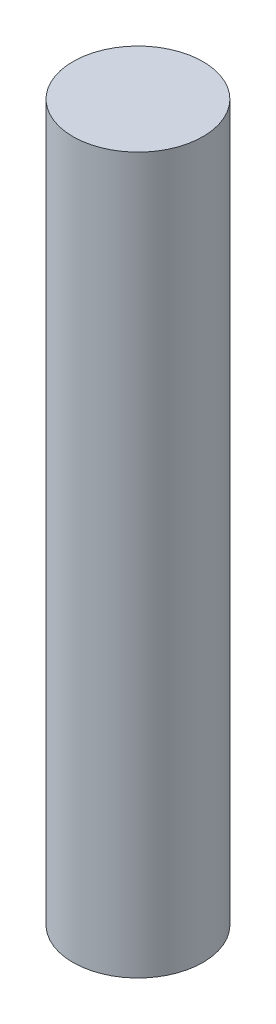
ISO-10303-21;
HEADER;
FILE_DESCRIPTION(('STEP AP214'),'2;1');
FILE_NAME('part.step','',(''),(''),'','','');
FILE_SCHEMA(('AUTOMOTIVE_DESIGN { 1 0 10303 214 1 1 1 1 }'));
ENDSEC;
DATA;
#1=APPLICATION_CONTEXT('core data for automotive mechanical design processes');
#2=APPLICATION_PROTOCOL_DEFINITION('international standard','automotive_design',2000,#1);
#3=PRODUCT_CONTEXT('',#1,'mechanical');
#4=PRODUCT('Part','Part','',(#3));
#5=PRODUCT_RELATED_PRODUCT_CATEGORY('part','',(#4));
#6=PRODUCT_DEFINITION_FORMATION('','',#4);
#7=PRODUCT_DEFINITION_CONTEXT('part definition',#1,'design');
#8=PRODUCT_DEFINITION('design','',#6,#7);
#9=PRODUCT_DEFINITION_SHAPE('','',#8);
#10=(LENGTH_UNIT() NAMED_UNIT(*) SI_UNIT(.MILLI.,.METRE.));
#11=(NAMED_UNIT(*) PLANE_ANGLE_UNIT() SI_UNIT($,.RADIAN.));
#12=(NAMED_UNIT(*) SI_UNIT($,.STERADIAN.) SOLID_ANGLE_UNIT());
#13=UNCERTAINTY_MEASURE_WITH_UNIT(LENGTH_MEASURE(1.E-05),#10,'distance_accuracy_value','');
#14=(GEOMETRIC_REPRESENTATION_CONTEXT(3) GLOBAL_UNCERTAINTY_ASSIGNED_CONTEXT((#13)) GLOBAL_UNIT_ASSIGNED_CONTEXT((#10,
#11,#12)) REPRESENTATION_CONTEXT('',''));
#15=CARTESIAN_POINT('',(0.,0.,0.));
#16=DIRECTION('',(0.,0.,1.));
#17=DIRECTION('',(1.,0.,0.));
#18=AXIS2_PLACEMENT_3D('',#15,#16,#17);
#19=CARTESIAN_POINT('',(0.,22.,0.));
#20=DIRECTION('',(0.,-1.,0.));
#21=DIRECTION('',(0.,0.,-1.));
#22=AXIS2_PLACEMENT_3D('',#19,#20,#21);
#23=CYLINDRICAL_SURFACE('',#22,2.);
#24=CARTESIAN_POINT('',(0.,22.,0.));
#25=DIRECTION('',(0.,1.,0.));
#26=DIRECTION('',(0.,0.,1.));
#27=AXIS2_PLACEMENT_3D('',#24,#25,#26);
#28=CIRCLE('',#27,2.);
#29=CARTESIAN_POINT('',(0.,22.,2.));
#30=VERTEX_POINT('',#29);
#31=EDGE_CURVE('E10',#30,#30,#28,.T.);
#32=ORIENTED_EDGE('',*,*,#31,.F.);
#33=EDGE_LOOP('',(#32));
#34=FACE_BOUND('',#33,.T.);
#35=CARTESIAN_POINT('',(0.,0.,0.));
#36=DIRECTION('',(0.,1.,0.));
#37=DIRECTION('',(0.,0.,1.));
#38=AXIS2_PLACEMENT_3D('',#35,#36,#37);
#39=CIRCLE('',#38,2.);
#40=CARTESIAN_POINT('',(0.,0.,2.));
#41=VERTEX_POINT('',#40);
#42=EDGE_CURVE('E46',#41,#41,#39,.T.);
#43=ORIENTED_EDGE('',*,*,#42,.T.);
#44=EDGE_LOOP('',(#43));
#45=FACE_BOUND('',#44,.T.);
#46=ADVANCED_FACE('F43',(#34,#45),#23,.T.);
#47=CARTESIAN_POINT('',(0.,22.,0.));
#48=DIRECTION('',(0.,1.,0.));
#49=DIRECTION('',(0.,0.,1.));
#50=AXIS2_PLACEMENT_3D('',#47,#48,#49);
#51=PLANE('',#50);
#52=ORIENTED_EDGE('',*,*,#31,.T.);
#53=EDGE_LOOP('',(#52));
#54=FACE_BOUND('',#53,.T.);
#55=ADVANCED_FACE('F60',(#54),#51,.T.);
#56=CARTESIAN_POINT('',(0.,0.,0.));
#57=DIRECTION('',(0.,1.,0.));
#58=DIRECTION('',(0.,0.,1.));
#59=AXIS2_PLACEMENT_3D('',#56,#57,#58);
#60=PLANE('',#59);
#61=ORIENTED_EDGE('',*,*,#42,.F.);
#62=EDGE_LOOP('',(#61));
#63=FACE_BOUND('',#62,.T.);
#64=ADVANCED_FACE('F58',(#63),#60,.F.);
#65=CLOSED_SHELL('',(#46,#55,#64));
#66=MANIFOLD_SOLID_BREP('B2',#65);
#67=ADVANCED_BREP_SHAPE_REPRESENTATION('',(#18,#66),#14);
#68=SHAPE_DEFINITION_REPRESENTATION(#9,#67);
ENDSEC;
END-ISO-10303-21;
